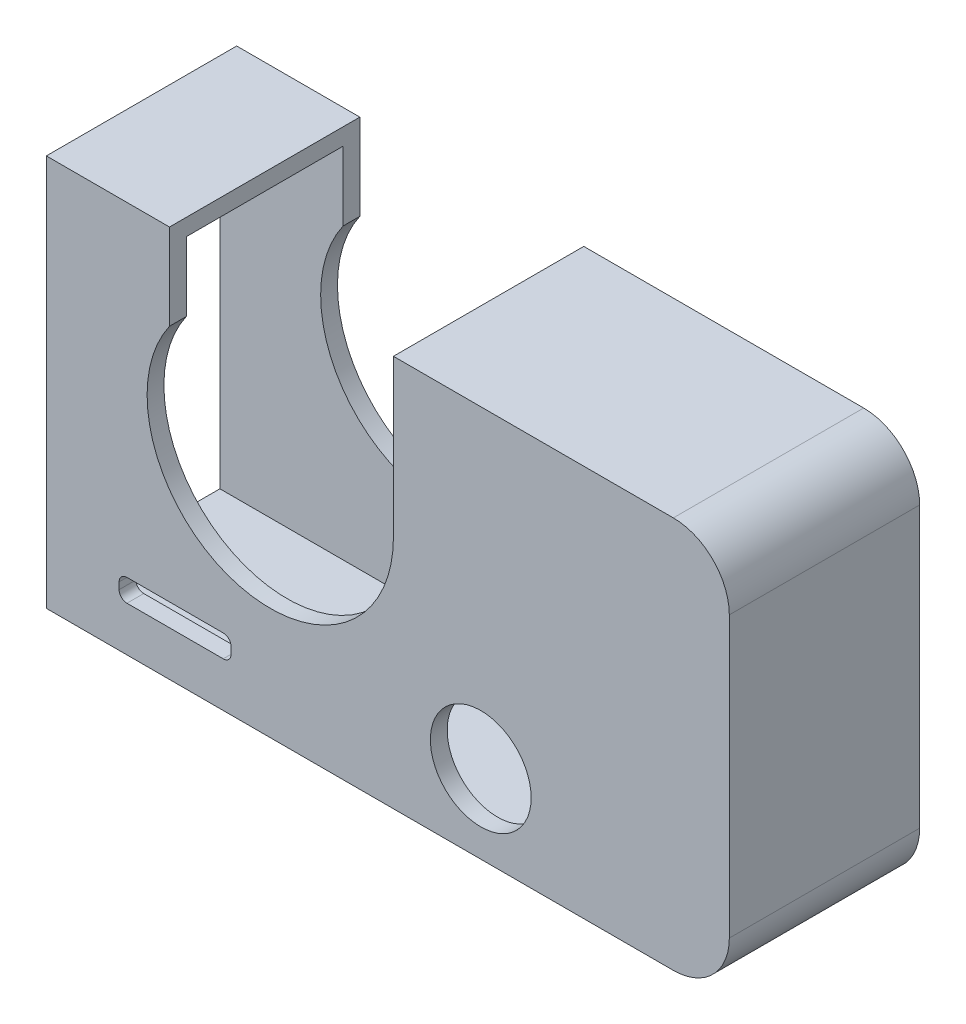
ISO-10303-21;
HEADER;
FILE_DESCRIPTION(('STEP AP214'),'2;1');
FILE_NAME('part.step','',(''),(''),'','','');
FILE_SCHEMA(('AUTOMOTIVE_DESIGN { 1 0 10303 214 1 1 1 1 }'));
ENDSEC;
DATA;
#1=APPLICATION_CONTEXT('core data for automotive mechanical design processes');
#2=APPLICATION_PROTOCOL_DEFINITION('international standard','automotive_design',2000,#1);
#3=PRODUCT_CONTEXT('',#1,'mechanical');
#4=PRODUCT('Part','Part','',(#3));
#5=PRODUCT_RELATED_PRODUCT_CATEGORY('part','',(#4));
#6=PRODUCT_DEFINITION_FORMATION('','',#4);
#7=PRODUCT_DEFINITION_CONTEXT('part definition',#1,'design');
#8=PRODUCT_DEFINITION('design','',#6,#7);
#9=PRODUCT_DEFINITION_SHAPE('','',#8);
#10=(LENGTH_UNIT() NAMED_UNIT(*) SI_UNIT(.MILLI.,.METRE.));
#11=(NAMED_UNIT(*) PLANE_ANGLE_UNIT() SI_UNIT($,.RADIAN.));
#12=(NAMED_UNIT(*) SI_UNIT($,.STERADIAN.) SOLID_ANGLE_UNIT());
#13=UNCERTAINTY_MEASURE_WITH_UNIT(LENGTH_MEASURE(1.E-05),#10,'distance_accuracy_value','');
#14=(GEOMETRIC_REPRESENTATION_CONTEXT(3) GLOBAL_UNCERTAINTY_ASSIGNED_CONTEXT((#13)) GLOBAL_UNIT_ASSIGNED_CONTEXT((#10,
#11,#12)) REPRESENTATION_CONTEXT('',''));
#15=CARTESIAN_POINT('',(0.,0.,0.));
#16=DIRECTION('',(0.,0.,1.));
#17=DIRECTION('',(1.,0.,0.));
#18=AXIS2_PLACEMENT_3D('',#15,#16,#17);
#19=CARTESIAN_POINT('',(20.,21.,17.));
#20=DIRECTION('',(0.,0.,-1.));
#21=DIRECTION('',(-1.,0.,0.));
#22=AXIS2_PLACEMENT_3D('',#19,#20,#21);
#23=CYLINDRICAL_SURFACE('',#22,11.);
#24=DIRECTION('',(0.,0.,-1.));
#25=VECTOR('',#24,1.);
#26=CARTESIAN_POINT('',(11.,27.3245553203368,17.));
#27=LINE('',#26,#25);
#28=CARTESIAN_POINT('',(11.,27.3245553203368,1.5));
#29=VERTEX_POINT('',#28);
#30=CARTESIAN_POINT('',(11.,27.3245553203368,0.));
#31=VERTEX_POINT('',#30);
#32=EDGE_CURVE('E466',#29,#31,#27,.T.);
#33=ORIENTED_EDGE('',*,*,#32,.F.);
#34=CARTESIAN_POINT('',(20.,21.,1.5));
#35=DIRECTION('',(0.,0.,1.));
#36=DIRECTION('',(1.,0.,0.));
#37=AXIS2_PLACEMENT_3D('',#34,#35,#36);
#38=CIRCLE('',#37,11.);
#39=CARTESIAN_POINT('',(31.,21.,1.5));
#40=VERTEX_POINT('',#39);
#41=EDGE_CURVE('E350',#29,#40,#38,.T.);
#42=ORIENTED_EDGE('',*,*,#41,.T.);
#43=DIRECTION('',(0.,0.,-1.));
#44=VECTOR('',#43,1.);
#45=CARTESIAN_POINT('',(31.,21.,17.));
#46=LINE('',#45,#44);
#47=CARTESIAN_POINT('',(31.,21.,0.));
#48=VERTEX_POINT('',#47);
#49=EDGE_CURVE('E471',#40,#48,#46,.T.);
#50=ORIENTED_EDGE('',*,*,#49,.T.);
#51=CARTESIAN_POINT('',(20.,21.,0.));
#52=DIRECTION('',(0.,0.,1.));
#53=DIRECTION('',(1.,0.,0.));
#54=AXIS2_PLACEMENT_3D('',#51,#52,#53);
#55=CIRCLE('',#54,11.);
#56=EDGE_CURVE('E429',#31,#48,#55,.T.);
#57=ORIENTED_EDGE('',*,*,#56,.F.);
#58=EDGE_LOOP('',(#33,#42,#50,#57));
#59=FACE_BOUND('',#58,.T.);
#60=ADVANCED_FACE('F41',(#59),#23,.F.);
#61=CARTESIAN_POINT('',(61.,0.,17.));
#62=DIRECTION('',(-1.,0.,0.));
#63=DIRECTION('',(0.,0.,1.));
#64=AXIS2_PLACEMENT_3D('',#61,#62,#63);
#65=PLANE('',#64);
#66=DIRECTION('',(0.,1.,0.));
#67=VECTOR('',#66,1.);
#68=CARTESIAN_POINT('',(61.,0.,0.));
#69=LINE('',#68,#67);
#70=CARTESIAN_POINT('',(61.,5.,0.));
#71=VERTEX_POINT('',#70);
#72=CARTESIAN_POINT('',(61.,30.,0.));
#73=VERTEX_POINT('',#72);
#74=EDGE_CURVE('E375',#71,#73,#69,.T.);
#75=ORIENTED_EDGE('',*,*,#74,.T.);
#76=DIRECTION('',(0.,0.,-1.));
#77=VECTOR('',#76,1.);
#78=CARTESIAN_POINT('',(61.,30.,17.));
#79=LINE('',#78,#77);
#80=CARTESIAN_POINT('',(61.,30.,17.));
#81=VERTEX_POINT('',#80);
#82=EDGE_CURVE('E482',#81,#73,#79,.T.);
#83=ORIENTED_EDGE('',*,*,#82,.F.);
#84=DIRECTION('',(0.,1.,0.));
#85=VECTOR('',#84,1.);
#86=CARTESIAN_POINT('',(61.,0.,17.));
#87=LINE('',#86,#85);
#88=CARTESIAN_POINT('',(61.,5.,17.));
#89=VERTEX_POINT('',#88);
#90=EDGE_CURVE('E376',#89,#81,#87,.T.);
#91=ORIENTED_EDGE('',*,*,#90,.F.);
#92=DIRECTION('',(0.,0.,-1.));
#93=VECTOR('',#92,1.);
#94=CARTESIAN_POINT('',(61.,5.,17.));
#95=LINE('',#94,#93);
#96=EDGE_CURVE('E413',#89,#71,#95,.T.);
#97=ORIENTED_EDGE('',*,*,#96,.T.);
#98=EDGE_LOOP('',(#75,#83,#91,#97));
#99=FACE_BOUND('',#98,.T.);
#100=ADVANCED_FACE('F43',(#99),#65,.F.);
#101=CARTESIAN_POINT('',(56.,30.,17.));
#102=DIRECTION('',(0.,0.,-1.));
#103=DIRECTION('',(-1.,0.,0.));
#104=AXIS2_PLACEMENT_3D('',#101,#102,#103);
#105=CYLINDRICAL_SURFACE('',#104,5.);
#106=CARTESIAN_POINT('',(56.,30.,0.));
#107=DIRECTION('',(0.,0.,1.));
#108=DIRECTION('',(1.,0.,0.));
#109=AXIS2_PLACEMENT_3D('',#106,#107,#108);
#110=CIRCLE('',#109,5.);
#111=CARTESIAN_POINT('',(56.,35.,0.));
#112=VERTEX_POINT('',#111);
#113=EDGE_CURVE('E417',#73,#112,#110,.T.);
#114=ORIENTED_EDGE('',*,*,#113,.T.);
#115=DIRECTION('',(0.,0.,-1.));
#116=VECTOR('',#115,1.);
#117=CARTESIAN_POINT('',(56.,35.,17.));
#118=LINE('',#117,#116);
#119=CARTESIAN_POINT('',(56.,35.,17.));
#120=VERTEX_POINT('',#119);
#121=EDGE_CURVE('E479',#120,#112,#118,.T.);
#122=ORIENTED_EDGE('',*,*,#121,.F.);
#123=CARTESIAN_POINT('',(56.,30.,17.));
#124=DIRECTION('',(0.,0.,1.));
#125=DIRECTION('',(1.,0.,0.));
#126=AXIS2_PLACEMENT_3D('',#123,#124,#125);
#127=CIRCLE('',#126,5.);
#128=EDGE_CURVE('E380',#81,#120,#127,.T.);
#129=ORIENTED_EDGE('',*,*,#128,.F.);
#130=ORIENTED_EDGE('',*,*,#82,.T.);
#131=EDGE_LOOP('',(#114,#122,#129,#130));
#132=FACE_BOUND('',#131,.T.);
#133=ADVANCED_FACE('F571',(#132),#105,.T.);
#134=CARTESIAN_POINT('',(0.,35.,17.));
#135=DIRECTION('',(0.,1.,0.));
#136=DIRECTION('',(0.,0.,1.));
#137=AXIS2_PLACEMENT_3D('',#134,#135,#136);
#138=PLANE('',#137);
#139=DIRECTION('',(1.,0.,0.));
#140=VECTOR('',#139,1.);
#141=CARTESIAN_POINT('',(0.,35.,0.));
#142=LINE('',#141,#140);
#143=CARTESIAN_POINT('',(31.,35.,0.));
#144=VERTEX_POINT('',#143);
#145=EDGE_CURVE('E421',#144,#112,#142,.T.);
#146=ORIENTED_EDGE('',*,*,#145,.F.);
#147=DIRECTION('',(0.,0.,-1.));
#148=VECTOR('',#147,1.);
#149=CARTESIAN_POINT('',(31.,35.,17.));
#150=LINE('',#149,#148);
#151=CARTESIAN_POINT('',(31.,35.,17.));
#152=VERTEX_POINT('',#151);
#153=EDGE_CURVE('E476',#152,#144,#150,.T.);
#154=ORIENTED_EDGE('',*,*,#153,.F.);
#155=DIRECTION('',(1.,0.,0.));
#156=VECTOR('',#155,1.);
#157=CARTESIAN_POINT('',(0.,35.,17.));
#158=LINE('',#157,#156);
#159=EDGE_CURVE('E384',#152,#120,#158,.T.);
#160=ORIENTED_EDGE('',*,*,#159,.T.);
#161=ORIENTED_EDGE('',*,*,#121,.T.);
#162=EDGE_LOOP('',(#146,#154,#160,#161));
#163=FACE_BOUND('',#162,.T.);
#164=ADVANCED_FACE('F586',(#163),#138,.T.);
#165=CARTESIAN_POINT('',(31.,0.,17.));
#166=DIRECTION('',(-1.,0.,0.));
#167=DIRECTION('',(0.,0.,1.));
#168=AXIS2_PLACEMENT_3D('',#165,#166,#167);
#169=PLANE('',#168);
#170=DIRECTION('',(0.,1.,0.));
#171=VECTOR('',#170,1.);
#172=CARTESIAN_POINT('',(31.,0.,15.5));
#173=LINE('',#172,#171);
#174=CARTESIAN_POINT('',(31.,21.,15.5));
#175=VERTEX_POINT('',#174);
#176=CARTESIAN_POINT('',(31.,33.5,15.5));
#177=VERTEX_POINT('',#176);
#178=EDGE_CURVE('E369',#175,#177,#173,.T.);
#179=ORIENTED_EDGE('',*,*,#178,.F.);
#180=CARTESIAN_POINT('',(31.,21.,17.));
#181=VERTEX_POINT('',#180);
#182=EDGE_CURVE('E472',#181,#175,#46,.T.);
#183=ORIENTED_EDGE('',*,*,#182,.F.);
#184=DIRECTION('',(0.,1.,0.));
#185=VECTOR('',#184,1.);
#186=CARTESIAN_POINT('',(31.,0.,17.));
#187=LINE('',#186,#185);
#188=EDGE_CURVE('E388',#181,#152,#187,.T.);
#189=ORIENTED_EDGE('',*,*,#188,.T.);
#190=ORIENTED_EDGE('',*,*,#153,.T.);
#191=DIRECTION('',(0.,1.,0.));
#192=VECTOR('',#191,1.);
#193=CARTESIAN_POINT('',(31.,0.,0.));
#194=LINE('',#193,#192);
#195=EDGE_CURVE('E425',#48,#144,#194,.T.);
#196=ORIENTED_EDGE('',*,*,#195,.F.);
#197=ORIENTED_EDGE('',*,*,#49,.F.);
#198=DIRECTION('',(0.,1.,0.));
#199=VECTOR('',#198,1.);
#200=CARTESIAN_POINT('',(31.,0.,1.5));
#201=LINE('',#200,#199);
#202=CARTESIAN_POINT('',(31.,33.5,1.5));
#203=VERTEX_POINT('',#202);
#204=EDGE_CURVE('E362',#40,#203,#201,.T.);
#205=ORIENTED_EDGE('',*,*,#204,.T.);
#206=DIRECTION('',(0.,0.,-1.));
#207=VECTOR('',#206,1.);
#208=CARTESIAN_POINT('',(31.,33.5,17.));
#209=LINE('',#208,#207);
#210=EDGE_CURVE('E372',#177,#203,#209,.T.);
#211=ORIENTED_EDGE('',*,*,#210,.F.);
#212=EDGE_LOOP('',(#179,#183,#189,#190,#196,#197,#205,#211));
#213=FACE_BOUND('',#212,.T.);
#214=ADVANCED_FACE('F578',(#213),#169,.T.);
#215=CARTESIAN_POINT('',(20.,21.,15.5));
#216=DIRECTION('',(0.,0.,1.));
#217=DIRECTION('',(1.,0.,0.));
#218=AXIS2_PLACEMENT_3D('',#215,#216,#217);
#219=CIRCLE('',#218,11.);
#220=CARTESIAN_POINT('',(11.,27.3245553203368,15.5));
#221=VERTEX_POINT('',#220);
#222=EDGE_CURVE('E366',#221,#175,#219,.T.);
#223=ORIENTED_EDGE('',*,*,#222,.F.);
#224=CARTESIAN_POINT('',(11.,27.3245553203368,17.));
#225=VERTEX_POINT('',#224);
#226=EDGE_CURVE('E467',#225,#221,#27,.T.);
#227=ORIENTED_EDGE('',*,*,#226,.F.);
#228=CARTESIAN_POINT('',(20.,21.,17.));
#229=DIRECTION('',(0.,0.,1.));
#230=DIRECTION('',(1.,0.,0.));
#231=AXIS2_PLACEMENT_3D('',#228,#229,#230);
#232=CIRCLE('',#231,11.);
#233=EDGE_CURVE('E392',#225,#181,#232,.T.);
#234=ORIENTED_EDGE('',*,*,#233,.T.);
#235=ORIENTED_EDGE('',*,*,#182,.T.);
#236=EDGE_LOOP('',(#223,#227,#234,#235));
#237=FACE_BOUND('',#236,.T.);
#238=ADVANCED_FACE('F567',(#237),#23,.F.);
#239=CARTESIAN_POINT('',(11.,0.,17.));
#240=DIRECTION('',(-1.,0.,0.));
#241=DIRECTION('',(0.,0.,1.));
#242=AXIS2_PLACEMENT_3D('',#239,#240,#241);
#243=PLANE('',#242);
#244=ORIENTED_EDGE('',*,*,#226,.T.);
#245=DIRECTION('',(0.,1.,0.));
#246=VECTOR('',#245,1.);
#247=CARTESIAN_POINT('',(11.,0.,15.5));
#248=LINE('',#247,#246);
#249=CARTESIAN_POINT('',(11.,33.5,15.5));
#250=VERTEX_POINT('',#249);
#251=EDGE_CURVE('E493',#221,#250,#248,.T.);
#252=ORIENTED_EDGE('',*,*,#251,.T.);
#253=DIRECTION('',(0.,0.,-1.));
#254=VECTOR('',#253,1.);
#255=CARTESIAN_POINT('',(11.,33.5,17.));
#256=LINE('',#255,#254);
#257=CARTESIAN_POINT('',(11.,33.5,1.5));
#258=VERTEX_POINT('',#257);
#259=EDGE_CURVE('E489',#250,#258,#256,.T.);
#260=ORIENTED_EDGE('',*,*,#259,.T.);
#261=DIRECTION('',(0.,1.,0.));
#262=VECTOR('',#261,1.);
#263=CARTESIAN_POINT('',(11.,0.,1.5));
#264=LINE('',#263,#262);
#265=EDGE_CURVE('E486',#29,#258,#264,.T.);
#266=ORIENTED_EDGE('',*,*,#265,.F.);
#267=ORIENTED_EDGE('',*,*,#32,.T.);
#268=DIRECTION('',(0.,1.,0.));
#269=VECTOR('',#268,1.);
#270=CARTESIAN_POINT('',(11.,0.,0.));
#271=LINE('',#270,#269);
#272=CARTESIAN_POINT('',(11.,35.,0.));
#273=VERTEX_POINT('',#272);
#274=EDGE_CURVE('E433',#31,#273,#271,.T.);
#275=ORIENTED_EDGE('',*,*,#274,.T.);
#276=DIRECTION('',(0.,0.,-1.));
#277=VECTOR('',#276,1.);
#278=CARTESIAN_POINT('',(11.,35.,17.));
#279=LINE('',#278,#277);
#280=CARTESIAN_POINT('',(11.,35.,17.));
#281=VERTEX_POINT('',#280);
#282=EDGE_CURVE('E463',#281,#273,#279,.T.);
#283=ORIENTED_EDGE('',*,*,#282,.F.);
#284=DIRECTION('',(0.,1.,0.));
#285=VECTOR('',#284,1.);
#286=CARTESIAN_POINT('',(11.,0.,17.));
#287=LINE('',#286,#285);
#288=EDGE_CURVE('E396',#225,#281,#287,.T.);
#289=ORIENTED_EDGE('',*,*,#288,.F.);
#290=EDGE_LOOP('',(#244,#252,#260,#266,#267,#275,#283,#289));
#291=FACE_BOUND('',#290,.T.);
#292=ADVANCED_FACE('F577',(#291),#243,.F.);
#293=CARTESIAN_POINT('',(0.,35.,17.));
#294=DIRECTION('',(0.,1.,0.));
#295=DIRECTION('',(0.,0.,1.));
#296=AXIS2_PLACEMENT_3D('',#293,#294,#295);
#297=PLANE('',#296);
#298=DIRECTION('',(1.,0.,0.));
#299=VECTOR('',#298,1.);
#300=CARTESIAN_POINT('',(0.,35.,0.));
#301=LINE('',#300,#299);
#302=CARTESIAN_POINT('',(0.,35.,0.));
#303=VERTEX_POINT('',#302);
#304=EDGE_CURVE('E437',#303,#273,#301,.T.);
#305=ORIENTED_EDGE('',*,*,#304,.F.);
#306=DIRECTION('',(0.,0.,-1.));
#307=VECTOR('',#306,1.);
#308=CARTESIAN_POINT('',(0.,35.,17.));
#309=LINE('',#308,#307);
#310=CARTESIAN_POINT('',(0.,35.,17.));
#311=VERTEX_POINT('',#310);
#312=EDGE_CURVE('E460',#311,#303,#309,.T.);
#313=ORIENTED_EDGE('',*,*,#312,.F.);
#314=DIRECTION('',(1.,0.,0.));
#315=VECTOR('',#314,1.);
#316=CARTESIAN_POINT('',(0.,35.,17.));
#317=LINE('',#316,#315);
#318=EDGE_CURVE('E399',#311,#281,#317,.T.);
#319=ORIENTED_EDGE('',*,*,#318,.T.);
#320=ORIENTED_EDGE('',*,*,#282,.T.);
#321=EDGE_LOOP('',(#305,#313,#319,#320));
#322=FACE_BOUND('',#321,.T.);
#323=ADVANCED_FACE('F584',(#322),#297,.T.);
#324=CARTESIAN_POINT('',(0.,0.,17.));
#325=DIRECTION('',(-1.,0.,0.));
#326=DIRECTION('',(0.,0.,1.));
#327=AXIS2_PLACEMENT_3D('',#324,#325,#326);
#328=PLANE('',#327);
#329=DIRECTION('',(0.,-1.,0.));
#330=VECTOR('',#329,1.);
#331=CARTESIAN_POINT('',(0.,33.5,1.5));
#332=LINE('',#331,#330);
#333=CARTESIAN_POINT('',(0.,33.5,1.5));
#334=VERTEX_POINT('',#333);
#335=CARTESIAN_POINT('',(0.,1.5,1.5));
#336=VERTEX_POINT('',#335);
#337=EDGE_CURVE('E249',#334,#336,#332,.T.);
#338=ORIENTED_EDGE('',*,*,#337,.F.);
#339=DIRECTION('',(0.,0.,-1.));
#340=VECTOR('',#339,1.);
#341=CARTESIAN_POINT('',(0.,33.5,1.5));
#342=LINE('',#341,#340);
#343=CARTESIAN_POINT('',(0.,33.5,15.5));
#344=VERTEX_POINT('',#343);
#345=EDGE_CURVE('E254',#344,#334,#342,.T.);
#346=ORIENTED_EDGE('',*,*,#345,.F.);
#347=DIRECTION('',(0.,1.,0.));
#348=VECTOR('',#347,1.);
#349=CARTESIAN_POINT('',(0.,33.5,15.5));
#350=LINE('',#349,#348);
#351=CARTESIAN_POINT('',(0.,1.5,15.5));
#352=VERTEX_POINT('',#351);
#353=EDGE_CURVE('E235',#352,#344,#350,.T.);
#354=ORIENTED_EDGE('',*,*,#353,.F.);
#355=DIRECTION('',(0.,0.,1.));
#356=VECTOR('',#355,1.);
#357=CARTESIAN_POINT('',(0.,1.5,1.5));
#358=LINE('',#357,#356);
#359=EDGE_CURVE('E244',#336,#352,#358,.T.);
#360=ORIENTED_EDGE('',*,*,#359,.F.);
#361=EDGE_LOOP('',(#338,#346,#354,#360));
#362=FACE_BOUND('',#361,.T.);
#363=DIRECTION('',(0.,1.,0.));
#364=VECTOR('',#363,1.);
#365=CARTESIAN_POINT('',(0.,0.,0.));
#366=LINE('',#365,#364);
#367=CARTESIAN_POINT('',(0.,0.,0.));
#368=VERTEX_POINT('',#367);
#369=EDGE_CURVE('E441',#368,#303,#366,.T.);
#370=ORIENTED_EDGE('',*,*,#369,.F.);
#371=DIRECTION('',(0.,0.,-1.));
#372=VECTOR('',#371,1.);
#373=CARTESIAN_POINT('',(0.,0.,17.));
#374=LINE('',#373,#372);
#375=CARTESIAN_POINT('',(0.,0.,17.));
#376=VERTEX_POINT('',#375);
#377=EDGE_CURVE('E457',#376,#368,#374,.T.);
#378=ORIENTED_EDGE('',*,*,#377,.F.);
#379=DIRECTION('',(0.,1.,0.));
#380=VECTOR('',#379,1.);
#381=CARTESIAN_POINT('',(0.,0.,17.));
#382=LINE('',#381,#380);
#383=EDGE_CURVE('E403',#376,#311,#382,.T.);
#384=ORIENTED_EDGE('',*,*,#383,.T.);
#385=ORIENTED_EDGE('',*,*,#312,.T.);
#386=EDGE_LOOP('',(#370,#378,#384,#385));
#387=FACE_BOUND('',#386,.T.);
#388=ADVANCED_FACE('F251',(#362,#387),#328,.T.);
#389=CARTESIAN_POINT('',(0.,0.,17.));
#390=DIRECTION('',(0.,1.,0.));
#391=DIRECTION('',(0.,0.,1.));
#392=AXIS2_PLACEMENT_3D('',#389,#390,#391);
#393=PLANE('',#392);
#394=DIRECTION('',(1.,0.,0.));
#395=VECTOR('',#394,1.);
#396=CARTESIAN_POINT('',(0.,0.,0.));
#397=LINE('',#396,#395);
#398=CARTESIAN_POINT('',(56.,0.,0.));
#399=VERTEX_POINT('',#398);
#400=EDGE_CURVE('E445',#368,#399,#397,.T.);
#401=ORIENTED_EDGE('',*,*,#400,.T.);
#402=DIRECTION('',(0.,0.,-1.));
#403=VECTOR('',#402,1.);
#404=CARTESIAN_POINT('',(56.,0.,17.));
#405=LINE('',#404,#403);
#406=CARTESIAN_POINT('',(56.,0.,17.));
#407=VERTEX_POINT('',#406);
#408=EDGE_CURVE('E453',#407,#399,#405,.T.);
#409=ORIENTED_EDGE('',*,*,#408,.F.);
#410=DIRECTION('',(1.,0.,0.));
#411=VECTOR('',#410,1.);
#412=CARTESIAN_POINT('',(0.,0.,17.));
#413=LINE('',#412,#411);
#414=EDGE_CURVE('E407',#376,#407,#413,.T.);
#415=ORIENTED_EDGE('',*,*,#414,.F.);
#416=ORIENTED_EDGE('',*,*,#377,.T.);
#417=EDGE_LOOP('',(#401,#409,#415,#416));
#418=FACE_BOUND('',#417,.T.);
#419=ADVANCED_FACE('F643',(#418),#393,.F.);
#420=CARTESIAN_POINT('',(56.,5.,17.));
#421=DIRECTION('',(0.,0.,-1.));
#422=DIRECTION('',(-1.,0.,0.));
#423=AXIS2_PLACEMENT_3D('',#420,#421,#422);
#424=CYLINDRICAL_SURFACE('',#423,5.);
#425=CARTESIAN_POINT('',(56.,5.,0.));
#426=DIRECTION('',(0.,0.,1.));
#427=DIRECTION('',(1.,0.,0.));
#428=AXIS2_PLACEMENT_3D('',#425,#426,#427);
#429=CIRCLE('',#428,5.);
#430=EDGE_CURVE('E381',#399,#71,#429,.T.);
#431=ORIENTED_EDGE('',*,*,#430,.T.);
#432=ORIENTED_EDGE('',*,*,#96,.F.);
#433=CARTESIAN_POINT('',(56.,5.,17.));
#434=DIRECTION('',(0.,0.,1.));
#435=DIRECTION('',(1.,0.,0.));
#436=AXIS2_PLACEMENT_3D('',#433,#434,#435);
#437=CIRCLE('',#436,5.);
#438=EDGE_CURVE('E410',#407,#89,#437,.T.);
#439=ORIENTED_EDGE('',*,*,#438,.F.);
#440=ORIENTED_EDGE('',*,*,#408,.T.);
#441=EDGE_LOOP('',(#431,#432,#439,#440));
#442=FACE_BOUND('',#441,.T.);
#443=ADVANCED_FACE('F634',(#442),#424,.T.);
#444=CARTESIAN_POINT('',(0.,0.,17.));
#445=DIRECTION('',(0.,0.,1.));
#446=DIRECTION('',(1.,0.,0.));
#447=AXIS2_PLACEMENT_3D('',#444,#445,#446);
#448=PLANE('',#447);
#449=CARTESIAN_POINT('',(38.8,7.,17.));
#450=DIRECTION('',(0.,0.,1.));
#451=DIRECTION('',(1.,0.,0.));
#452=AXIS2_PLACEMENT_3D('',#449,#450,#451);
#453=CIRCLE('',#452,4.5);
#454=CARTESIAN_POINT('',(43.3,7.,17.));
#455=VERTEX_POINT('',#454);
#456=EDGE_CURVE('E623',#455,#455,#453,.T.);
#457=ORIENTED_EDGE('',*,*,#456,.F.);
#458=EDGE_LOOP('',(#457));
#459=FACE_BOUND('',#458,.T.);
#460=CARTESIAN_POINT('',(15.8,4.7,17.));
#461=DIRECTION('',(0.,0.,1.));
#462=DIRECTION('',(-1.,0.,0.));
#463=AXIS2_PLACEMENT_3D('',#460,#461,#462);
#464=CIRCLE('',#463,0.7);
#465=CARTESIAN_POINT('',(15.8,4.,17.));
#466=VERTEX_POINT('',#465);
#467=CARTESIAN_POINT('',(16.5,4.7,17.));
#468=VERTEX_POINT('',#467);
#469=EDGE_CURVE('E66',#466,#468,#464,.T.);
#470=ORIENTED_EDGE('',*,*,#469,.F.);
#471=DIRECTION('',(1.,0.,0.));
#472=VECTOR('',#471,1.);
#473=CARTESIAN_POINT('',(7.2,4.,17.));
#474=LINE('',#473,#472);
#475=CARTESIAN_POINT('',(7.2,4.,17.));
#476=VERTEX_POINT('',#475);
#477=EDGE_CURVE('E287',#476,#466,#474,.T.);
#478=ORIENTED_EDGE('',*,*,#477,.F.);
#479=CARTESIAN_POINT('',(7.2,4.7,17.));
#480=DIRECTION('',(0.,0.,1.));
#481=DIRECTION('',(1.,0.,0.));
#482=AXIS2_PLACEMENT_3D('',#479,#480,#481);
#483=CIRCLE('',#482,0.7);
#484=CARTESIAN_POINT('',(6.5,4.7,17.));
#485=VERTEX_POINT('',#484);
#486=EDGE_CURVE('E283',#485,#476,#483,.T.);
#487=ORIENTED_EDGE('',*,*,#486,.F.);
#488=DIRECTION('',(0.,-1.,0.));
#489=VECTOR('',#488,1.);
#490=CARTESIAN_POINT('',(6.5,4.7,17.));
#491=LINE('',#490,#489);
#492=CARTESIAN_POINT('',(6.5,5.3,17.));
#493=VERTEX_POINT('',#492);
#494=EDGE_CURVE('E279',#493,#485,#491,.T.);
#495=ORIENTED_EDGE('',*,*,#494,.F.);
#496=CARTESIAN_POINT('',(7.2,5.3,17.));
#497=DIRECTION('',(0.,0.,1.));
#498=DIRECTION('',(1.,0.,0.));
#499=AXIS2_PLACEMENT_3D('',#496,#497,#498);
#500=CIRCLE('',#499,0.7);
#501=CARTESIAN_POINT('',(7.2,6.,17.));
#502=VERTEX_POINT('',#501);
#503=EDGE_CURVE('E275',#502,#493,#500,.T.);
#504=ORIENTED_EDGE('',*,*,#503,.F.);
#505=DIRECTION('',(-1.,0.,0.));
#506=VECTOR('',#505,1.);
#507=CARTESIAN_POINT('',(7.2,6.,17.));
#508=LINE('',#507,#506);
#509=CARTESIAN_POINT('',(15.8,6.,17.));
#510=VERTEX_POINT('',#509);
#511=EDGE_CURVE('E271',#510,#502,#508,.T.);
#512=ORIENTED_EDGE('',*,*,#511,.F.);
#513=CARTESIAN_POINT('',(15.8,5.3,17.));
#514=DIRECTION('',(0.,0.,1.));
#515=DIRECTION('',(1.,0.,0.));
#516=AXIS2_PLACEMENT_3D('',#513,#514,#515);
#517=CIRCLE('',#516,0.7);
#518=CARTESIAN_POINT('',(16.5,5.3,17.));
#519=VERTEX_POINT('',#518);
#520=EDGE_CURVE('E267',#519,#510,#517,.T.);
#521=ORIENTED_EDGE('',*,*,#520,.F.);
#522=DIRECTION('',(0.,1.,0.));
#523=VECTOR('',#522,1.);
#524=CARTESIAN_POINT('',(16.5,4.7,17.));
#525=LINE('',#524,#523);
#526=EDGE_CURVE('E263',#468,#519,#525,.T.);
#527=ORIENTED_EDGE('',*,*,#526,.F.);
#528=EDGE_LOOP('',(#470,#478,#487,#495,#504,#512,#521,#527));
#529=FACE_BOUND('',#528,.T.);
#530=ORIENTED_EDGE('',*,*,#90,.T.);
#531=ORIENTED_EDGE('',*,*,#128,.T.);
#532=ORIENTED_EDGE('',*,*,#159,.F.);
#533=ORIENTED_EDGE('',*,*,#188,.F.);
#534=ORIENTED_EDGE('',*,*,#233,.F.);
#535=ORIENTED_EDGE('',*,*,#288,.T.);
#536=ORIENTED_EDGE('',*,*,#318,.F.);
#537=ORIENTED_EDGE('',*,*,#383,.F.);
#538=ORIENTED_EDGE('',*,*,#414,.T.);
#539=ORIENTED_EDGE('',*,*,#438,.T.);
#540=EDGE_LOOP('',(#530,#531,#532,#533,#534,#535,#536,#537,#538,#539));
#541=FACE_BOUND('',#540,.T.);
#542=ADVANCED_FACE('F532',(#459,#529,#541),#448,.T.);
#543=CARTESIAN_POINT('',(0.,0.,0.));
#544=DIRECTION('',(0.,0.,1.));
#545=DIRECTION('',(1.,0.,0.));
#546=AXIS2_PLACEMENT_3D('',#543,#544,#545);
#547=PLANE('',#546);
#548=ORIENTED_EDGE('',*,*,#74,.F.);
#549=ORIENTED_EDGE('',*,*,#430,.F.);
#550=ORIENTED_EDGE('',*,*,#400,.F.);
#551=ORIENTED_EDGE('',*,*,#369,.T.);
#552=ORIENTED_EDGE('',*,*,#304,.T.);
#553=ORIENTED_EDGE('',*,*,#274,.F.);
#554=ORIENTED_EDGE('',*,*,#56,.T.);
#555=ORIENTED_EDGE('',*,*,#195,.T.);
#556=ORIENTED_EDGE('',*,*,#145,.T.);
#557=ORIENTED_EDGE('',*,*,#113,.F.);
#558=EDGE_LOOP('',(#548,#549,#550,#551,#552,#553,#554,#555,#556,#557));
#559=FACE_BOUND('',#558,.T.);
#560=ADVANCED_FACE('F633',(#559),#547,.F.);
#561=CARTESIAN_POINT('',(54.5,33.5,15.5));
#562=DIRECTION('',(0.,1.,0.));
#563=DIRECTION('',(0.,0.,1.));
#564=AXIS2_PLACEMENT_3D('',#561,#562,#563);
#565=PLANE('',#564);
#566=DIRECTION('',(1.,0.,0.));
#567=VECTOR('',#566,1.);
#568=CARTESIAN_POINT('',(54.5,33.5,15.5));
#569=LINE('',#568,#567);
#570=EDGE_CURVE('E316',#344,#250,#569,.T.);
#571=ORIENTED_EDGE('',*,*,#570,.F.);
#572=ORIENTED_EDGE('',*,*,#345,.T.);
#573=DIRECTION('',(1.,0.,0.));
#574=VECTOR('',#573,1.);
#575=CARTESIAN_POINT('',(54.5,33.5,1.5));
#576=LINE('',#575,#574);
#577=EDGE_CURVE('E329',#334,#258,#576,.T.);
#578=ORIENTED_EDGE('',*,*,#577,.T.);
#579=ORIENTED_EDGE('',*,*,#259,.F.);
#580=EDGE_LOOP('',(#571,#572,#578,#579));
#581=FACE_BOUND('',#580,.T.);
#582=ADVANCED_FACE('F640',(#581),#565,.F.);
#583=CARTESIAN_POINT('',(1.5,1.5,15.5));
#584=DIRECTION('',(0.,-1.,0.));
#585=DIRECTION('',(1.,0.,0.));
#586=AXIS2_PLACEMENT_3D('',#583,#584,#585);
#587=PLANE('',#586);
#588=ORIENTED_EDGE('',*,*,#359,.T.);
#589=DIRECTION('',(-1.,0.,0.));
#590=VECTOR('',#589,1.);
#591=CARTESIAN_POINT('',(1.5,1.5,15.5));
#592=LINE('',#591,#590);
#593=CARTESIAN_POINT('',(54.5,1.5,15.5));
#594=VERTEX_POINT('',#593);
#595=EDGE_CURVE('E231',#594,#352,#592,.T.);
#596=ORIENTED_EDGE('',*,*,#595,.F.);
#597=DIRECTION('',(0.,0.,-1.));
#598=VECTOR('',#597,1.);
#599=CARTESIAN_POINT('',(54.5,1.5,15.5));
#600=LINE('',#599,#598);
#601=CARTESIAN_POINT('',(54.5,1.5,1.5));
#602=VERTEX_POINT('',#601);
#603=EDGE_CURVE('E347',#594,#602,#600,.T.);
#604=ORIENTED_EDGE('',*,*,#603,.T.);
#605=DIRECTION('',(-1.,0.,0.));
#606=VECTOR('',#605,1.);
#607=CARTESIAN_POINT('',(1.5,1.5,1.5));
#608=LINE('',#607,#606);
#609=EDGE_CURVE('E58',#602,#336,#608,.T.);
#610=ORIENTED_EDGE('',*,*,#609,.T.);
#611=EDGE_LOOP('',(#588,#596,#604,#610));
#612=FACE_BOUND('',#611,.T.);
#613=ADVANCED_FACE('F245',(#612),#587,.F.);
#614=CARTESIAN_POINT('',(54.5,6.49999999999999,15.5));
#615=DIRECTION('',(0.,0.,-1.));
#616=DIRECTION('',(-1.,0.,0.));
#617=AXIS2_PLACEMENT_3D('',#614,#615,#616);
#618=CYLINDRICAL_SURFACE('',#617,5.);
#619=CARTESIAN_POINT('',(54.5,6.49999999999999,1.5));
#620=DIRECTION('',(0.,0.,-1.));
#621=DIRECTION('',(1.,0.,0.));
#622=AXIS2_PLACEMENT_3D('',#619,#620,#621);
#623=CIRCLE('',#622,5.);
#624=CARTESIAN_POINT('',(59.5,6.5,1.5));
#625=VERTEX_POINT('',#624);
#626=EDGE_CURVE('E341',#625,#602,#623,.T.);
#627=ORIENTED_EDGE('',*,*,#626,.T.);
#628=ORIENTED_EDGE('',*,*,#603,.F.);
#629=CARTESIAN_POINT('',(54.5,6.49999999999999,15.5));
#630=DIRECTION('',(0.,0.,-1.));
#631=DIRECTION('',(1.,0.,0.));
#632=AXIS2_PLACEMENT_3D('',#629,#630,#631);
#633=CIRCLE('',#632,5.);
#634=CARTESIAN_POINT('',(59.5,6.5,15.5));
#635=VERTEX_POINT('',#634);
#636=EDGE_CURVE('E239',#635,#594,#633,.T.);
#637=ORIENTED_EDGE('',*,*,#636,.F.);
#638=DIRECTION('',(0.,0.,-1.));
#639=VECTOR('',#638,1.);
#640=CARTESIAN_POINT('',(59.5,6.5,15.5));
#641=LINE('',#640,#639);
#642=EDGE_CURVE('E351',#635,#625,#641,.T.);
#643=ORIENTED_EDGE('',*,*,#642,.T.);
#644=EDGE_LOOP('',(#627,#628,#637,#643));
#645=FACE_BOUND('',#644,.T.);
#646=ADVANCED_FACE('F619',(#645),#618,.F.);
#647=CARTESIAN_POINT('',(59.5,6.5,15.5));
#648=DIRECTION('',(1.,0.,0.));
#649=DIRECTION('',(0.,0.,-1.));
#650=AXIS2_PLACEMENT_3D('',#647,#648,#649);
#651=PLANE('',#650);
#652=DIRECTION('',(0.,-1.,0.));
#653=VECTOR('',#652,1.);
#654=CARTESIAN_POINT('',(59.5,6.5,1.5));
#655=LINE('',#654,#653);
#656=CARTESIAN_POINT('',(59.5,28.5,1.5));
#657=VERTEX_POINT('',#656);
#658=EDGE_CURVE('E337',#657,#625,#655,.T.);
#659=ORIENTED_EDGE('',*,*,#658,.T.);
#660=ORIENTED_EDGE('',*,*,#642,.F.);
#661=DIRECTION('',(0.,-1.,0.));
#662=VECTOR('',#661,1.);
#663=CARTESIAN_POINT('',(59.5,6.5,15.5));
#664=LINE('',#663,#662);
#665=CARTESIAN_POINT('',(59.5,28.5,15.5));
#666=VERTEX_POINT('',#665);
#667=EDGE_CURVE('E324',#666,#635,#664,.T.);
#668=ORIENTED_EDGE('',*,*,#667,.F.);
#669=DIRECTION('',(0.,0.,-1.));
#670=VECTOR('',#669,1.);
#671=CARTESIAN_POINT('',(59.5,28.5,15.5));
#672=LINE('',#671,#670);
#673=EDGE_CURVE('E354',#666,#657,#672,.T.);
#674=ORIENTED_EDGE('',*,*,#673,.T.);
#675=EDGE_LOOP('',(#659,#660,#668,#674));
#676=FACE_BOUND('',#675,.T.);
#677=ADVANCED_FACE('F616',(#676),#651,.F.);
#678=CARTESIAN_POINT('',(54.5,28.5,15.5));
#679=DIRECTION('',(0.,0.,-1.));
#680=DIRECTION('',(-1.,0.,0.));
#681=AXIS2_PLACEMENT_3D('',#678,#679,#680);
#682=CYLINDRICAL_SURFACE('',#681,5.);
#683=CARTESIAN_POINT('',(54.5,28.5,1.5));
#684=DIRECTION('',(0.,0.,-1.));
#685=DIRECTION('',(-1.,0.,0.));
#686=AXIS2_PLACEMENT_3D('',#683,#684,#685);
#687=CIRCLE('',#686,5.);
#688=CARTESIAN_POINT('',(54.5,33.5,1.5));
#689=VERTEX_POINT('',#688);
#690=EDGE_CURVE('E333',#689,#657,#687,.T.);
#691=ORIENTED_EDGE('',*,*,#690,.T.);
#692=ORIENTED_EDGE('',*,*,#673,.F.);
#693=CARTESIAN_POINT('',(54.5,28.5,15.5));
#694=DIRECTION('',(0.,0.,-1.));
#695=DIRECTION('',(-1.,0.,0.));
#696=AXIS2_PLACEMENT_3D('',#693,#694,#695);
#697=CIRCLE('',#696,5.);
#698=CARTESIAN_POINT('',(54.5,33.5,15.5));
#699=VERTEX_POINT('',#698);
#700=EDGE_CURVE('E319',#699,#666,#697,.T.);
#701=ORIENTED_EDGE('',*,*,#700,.F.);
#702=DIRECTION('',(0.,0.,-1.));
#703=VECTOR('',#702,1.);
#704=CARTESIAN_POINT('',(54.5,33.5,15.5));
#705=LINE('',#704,#703);
#706=EDGE_CURVE('E241',#699,#689,#705,.T.);
#707=ORIENTED_EDGE('',*,*,#706,.T.);
#708=EDGE_LOOP('',(#691,#692,#701,#707));
#709=FACE_BOUND('',#708,.T.);
#710=ADVANCED_FACE('F611',(#709),#682,.F.);
#711=ORIENTED_EDGE('',*,*,#210,.T.);
#712=EDGE_CURVE('E295',#203,#689,#576,.T.);
#713=ORIENTED_EDGE('',*,*,#712,.T.);
#714=ORIENTED_EDGE('',*,*,#706,.F.);
#715=EDGE_CURVE('E320',#177,#699,#569,.T.);
#716=ORIENTED_EDGE('',*,*,#715,.F.);
#717=EDGE_LOOP('',(#711,#713,#714,#716));
#718=FACE_BOUND('',#717,.T.);
#719=ADVANCED_FACE('F602',(#718),#565,.F.);
#720=CARTESIAN_POINT('',(54.5,6.49999999999999,15.5));
#721=DIRECTION('',(0.,0.,1.));
#722=DIRECTION('',(1.,0.,0.));
#723=AXIS2_PLACEMENT_3D('',#720,#721,#722);
#724=PLANE('',#723);
#725=CARTESIAN_POINT('',(38.8,7.,15.5));
#726=DIRECTION('',(0.,0.,1.));
#727=DIRECTION('',(1.,0.,0.));
#728=AXIS2_PLACEMENT_3D('',#725,#726,#727);
#729=CIRCLE('',#728,4.5);
#730=CARTESIAN_POINT('',(43.3,7.,15.5));
#731=VERTEX_POINT('',#730);
#732=EDGE_CURVE('E45',#731,#731,#729,.T.);
#733=ORIENTED_EDGE('',*,*,#732,.T.);
#734=EDGE_LOOP('',(#733));
#735=FACE_BOUND('',#734,.T.);
#736=DIRECTION('',(-1.,0.,0.));
#737=VECTOR('',#736,1.);
#738=CARTESIAN_POINT('',(54.5,6.,15.5));
#739=LINE('',#738,#737);
#740=CARTESIAN_POINT('',(15.8,6.,15.5));
#741=VERTEX_POINT('',#740);
#742=CARTESIAN_POINT('',(7.2,6.,15.5));
#743=VERTEX_POINT('',#742);
#744=EDGE_CURVE('E505',#741,#743,#739,.T.);
#745=ORIENTED_EDGE('',*,*,#744,.T.);
#746=CARTESIAN_POINT('',(7.2,5.3,15.5));
#747=DIRECTION('',(0.,0.,1.));
#748=DIRECTION('',(1.,0.,0.));
#749=AXIS2_PLACEMENT_3D('',#746,#747,#748);
#750=CIRCLE('',#749,0.7);
#751=CARTESIAN_POINT('',(6.5,5.3,15.5));
#752=VERTEX_POINT('',#751);
#753=EDGE_CURVE('E508',#743,#752,#750,.T.);
#754=ORIENTED_EDGE('',*,*,#753,.T.);
#755=DIRECTION('',(0.,-1.,0.));
#756=VECTOR('',#755,1.);
#757=CARTESIAN_POINT('',(6.5,6.49999999999999,15.5));
#758=LINE('',#757,#756);
#759=CARTESIAN_POINT('',(6.5,4.7,15.5));
#760=VERTEX_POINT('',#759);
#761=EDGE_CURVE('E512',#752,#760,#758,.T.);
#762=ORIENTED_EDGE('',*,*,#761,.T.);
#763=CARTESIAN_POINT('',(7.2,4.7,15.5));
#764=DIRECTION('',(0.,0.,1.));
#765=DIRECTION('',(1.,0.,0.));
#766=AXIS2_PLACEMENT_3D('',#763,#764,#765);
#767=CIRCLE('',#766,0.7);
#768=CARTESIAN_POINT('',(7.2,4.,15.5));
#769=VERTEX_POINT('',#768);
#770=EDGE_CURVE('E516',#760,#769,#767,.T.);
#771=ORIENTED_EDGE('',*,*,#770,.T.);
#772=DIRECTION('',(1.,0.,0.));
#773=VECTOR('',#772,1.);
#774=CARTESIAN_POINT('',(54.5,4.,15.5));
#775=LINE('',#774,#773);
#776=CARTESIAN_POINT('',(15.8,4.,15.5));
#777=VERTEX_POINT('',#776);
#778=EDGE_CURVE('E51',#769,#777,#775,.T.);
#779=ORIENTED_EDGE('',*,*,#778,.T.);
#780=CARTESIAN_POINT('',(15.8,4.7,15.5));
#781=DIRECTION('',(0.,0.,1.));
#782=DIRECTION('',(1.,0.,0.));
#783=AXIS2_PLACEMENT_3D('',#780,#781,#782);
#784=CIRCLE('',#783,0.7);
#785=CARTESIAN_POINT('',(16.5,4.7,15.5));
#786=VERTEX_POINT('',#785);
#787=EDGE_CURVE('E11',#777,#786,#784,.T.);
#788=ORIENTED_EDGE('',*,*,#787,.T.);
#789=DIRECTION('',(0.,1.,0.));
#790=VECTOR('',#789,1.);
#791=CARTESIAN_POINT('',(16.5,6.49999999999999,15.5));
#792=LINE('',#791,#790);
#793=CARTESIAN_POINT('',(16.5,5.3,15.5));
#794=VERTEX_POINT('',#793);
#795=EDGE_CURVE('E497',#786,#794,#792,.T.);
#796=ORIENTED_EDGE('',*,*,#795,.T.);
#797=CARTESIAN_POINT('',(15.8,5.3,15.5));
#798=DIRECTION('',(0.,0.,1.));
#799=DIRECTION('',(1.,0.,0.));
#800=AXIS2_PLACEMENT_3D('',#797,#798,#799);
#801=CIRCLE('',#800,0.7);
#802=EDGE_CURVE('E501',#794,#741,#801,.T.);
#803=ORIENTED_EDGE('',*,*,#802,.T.);
#804=EDGE_LOOP('',(#745,#754,#762,#771,#779,#788,#796,#803));
#805=FACE_BOUND('',#804,.T.);
#806=ORIENTED_EDGE('',*,*,#222,.T.);
#807=ORIENTED_EDGE('',*,*,#178,.T.);
#808=ORIENTED_EDGE('',*,*,#715,.T.);
#809=ORIENTED_EDGE('',*,*,#700,.T.);
#810=ORIENTED_EDGE('',*,*,#667,.T.);
#811=ORIENTED_EDGE('',*,*,#636,.T.);
#812=ORIENTED_EDGE('',*,*,#595,.T.);
#813=ORIENTED_EDGE('',*,*,#353,.T.);
#814=ORIENTED_EDGE('',*,*,#570,.T.);
#815=ORIENTED_EDGE('',*,*,#251,.F.);
#816=EDGE_LOOP('',(#806,#807,#808,#809,#810,#811,#812,#813,#814,#815));
#817=FACE_BOUND('',#816,.T.);
#818=ADVANCED_FACE('F232',(#735,#805,#817),#724,.F.);
#819=CARTESIAN_POINT('',(54.5,6.49999999999999,1.5));
#820=DIRECTION('',(0.,0.,1.));
#821=DIRECTION('',(1.,0.,0.));
#822=AXIS2_PLACEMENT_3D('',#819,#820,#821);
#823=PLANE('',#822);
#824=ORIENTED_EDGE('',*,*,#337,.T.);
#825=ORIENTED_EDGE('',*,*,#609,.F.);
#826=ORIENTED_EDGE('',*,*,#626,.F.);
#827=ORIENTED_EDGE('',*,*,#658,.F.);
#828=ORIENTED_EDGE('',*,*,#690,.F.);
#829=ORIENTED_EDGE('',*,*,#712,.F.);
#830=ORIENTED_EDGE('',*,*,#204,.F.);
#831=ORIENTED_EDGE('',*,*,#41,.F.);
#832=ORIENTED_EDGE('',*,*,#265,.T.);
#833=ORIENTED_EDGE('',*,*,#577,.F.);
#834=EDGE_LOOP('',(#824,#825,#826,#827,#828,#829,#830,#831,#832,#833));
#835=FACE_BOUND('',#834,.T.);
#836=ADVANCED_FACE('F613',(#835),#823,.T.);
#837=CARTESIAN_POINT('',(15.8,4.7,12.));
#838=DIRECTION('',(0.,0.,1.));
#839=DIRECTION('',(1.,0.,0.));
#840=AXIS2_PLACEMENT_3D('',#837,#838,#839);
#841=CYLINDRICAL_SURFACE('',#840,0.7);
#842=DIRECTION('',(0.,0.,1.));
#843=VECTOR('',#842,1.);
#844=CARTESIAN_POINT('',(15.8,4.,12.));
#845=LINE('',#844,#843);
#846=EDGE_CURVE('E292',#777,#466,#845,.T.);
#847=ORIENTED_EDGE('',*,*,#846,.T.);
#848=ORIENTED_EDGE('',*,*,#469,.T.);
#849=DIRECTION('',(0.,0.,1.));
#850=VECTOR('',#849,1.);
#851=CARTESIAN_POINT('',(16.5,4.7,12.));
#852=LINE('',#851,#850);
#853=EDGE_CURVE('E291',#786,#468,#852,.T.);
#854=ORIENTED_EDGE('',*,*,#853,.F.);
#855=ORIENTED_EDGE('',*,*,#787,.F.);
#856=EDGE_LOOP('',(#847,#848,#854,#855));
#857=FACE_BOUND('',#856,.T.);
#858=ADVANCED_FACE('F526',(#857),#841,.F.);
#859=CARTESIAN_POINT('',(7.2,4.,12.));
#860=DIRECTION('',(0.,-1.,0.));
#861=DIRECTION('',(1.,0.,0.));
#862=AXIS2_PLACEMENT_3D('',#859,#860,#861);
#863=PLANE('',#862);
#864=DIRECTION('',(0.,0.,1.));
#865=VECTOR('',#864,1.);
#866=CARTESIAN_POINT('',(7.2,4.,12.));
#867=LINE('',#866,#865);
#868=EDGE_CURVE('E296',#769,#476,#867,.T.);
#869=ORIENTED_EDGE('',*,*,#868,.T.);
#870=ORIENTED_EDGE('',*,*,#477,.T.);
#871=ORIENTED_EDGE('',*,*,#846,.F.);
#872=ORIENTED_EDGE('',*,*,#778,.F.);
#873=EDGE_LOOP('',(#869,#870,#871,#872));
#874=FACE_BOUND('',#873,.T.);
#875=ADVANCED_FACE('F527',(#874),#863,.F.);
#876=CARTESIAN_POINT('',(7.2,4.7,12.));
#877=DIRECTION('',(0.,0.,1.));
#878=DIRECTION('',(1.,0.,0.));
#879=AXIS2_PLACEMENT_3D('',#876,#877,#878);
#880=CYLINDRICAL_SURFACE('',#879,0.7);
#881=DIRECTION('',(0.,0.,1.));
#882=VECTOR('',#881,1.);
#883=CARTESIAN_POINT('',(6.5,4.7,12.));
#884=LINE('',#883,#882);
#885=EDGE_CURVE('E299',#760,#485,#884,.T.);
#886=ORIENTED_EDGE('',*,*,#885,.T.);
#887=ORIENTED_EDGE('',*,*,#486,.T.);
#888=ORIENTED_EDGE('',*,*,#868,.F.);
#889=ORIENTED_EDGE('',*,*,#770,.F.);
#890=EDGE_LOOP('',(#886,#887,#888,#889));
#891=FACE_BOUND('',#890,.T.);
#892=ADVANCED_FACE('F555',(#891),#880,.F.);
#893=CARTESIAN_POINT('',(6.5,4.7,12.));
#894=DIRECTION('',(-1.,0.,0.));
#895=DIRECTION('',(0.,0.,1.));
#896=AXIS2_PLACEMENT_3D('',#893,#894,#895);
#897=PLANE('',#896);
#898=DIRECTION('',(0.,0.,1.));
#899=VECTOR('',#898,1.);
#900=CARTESIAN_POINT('',(6.5,5.3,12.));
#901=LINE('',#900,#899);
#902=EDGE_CURVE('E302',#752,#493,#901,.T.);
#903=ORIENTED_EDGE('',*,*,#902,.T.);
#904=ORIENTED_EDGE('',*,*,#494,.T.);
#905=ORIENTED_EDGE('',*,*,#885,.F.);
#906=ORIENTED_EDGE('',*,*,#761,.F.);
#907=EDGE_LOOP('',(#903,#904,#905,#906));
#908=FACE_BOUND('',#907,.T.);
#909=ADVANCED_FACE('F553',(#908),#897,.F.);
#910=CARTESIAN_POINT('',(7.2,5.3,12.));
#911=DIRECTION('',(0.,0.,1.));
#912=DIRECTION('',(1.,0.,0.));
#913=AXIS2_PLACEMENT_3D('',#910,#911,#912);
#914=CYLINDRICAL_SURFACE('',#913,0.7);
#915=DIRECTION('',(0.,0.,1.));
#916=VECTOR('',#915,1.);
#917=CARTESIAN_POINT('',(7.2,6.,12.));
#918=LINE('',#917,#916);
#919=EDGE_CURVE('E305',#743,#502,#918,.T.);
#920=ORIENTED_EDGE('',*,*,#919,.T.);
#921=ORIENTED_EDGE('',*,*,#503,.T.);
#922=ORIENTED_EDGE('',*,*,#902,.F.);
#923=ORIENTED_EDGE('',*,*,#753,.F.);
#924=EDGE_LOOP('',(#920,#921,#922,#923));
#925=FACE_BOUND('',#924,.T.);
#926=ADVANCED_FACE('F548',(#925),#914,.F.);
#927=CARTESIAN_POINT('',(7.2,6.,12.));
#928=DIRECTION('',(0.,1.,0.));
#929=DIRECTION('',(0.,0.,1.));
#930=AXIS2_PLACEMENT_3D('',#927,#928,#929);
#931=PLANE('',#930);
#932=DIRECTION('',(0.,0.,1.));
#933=VECTOR('',#932,1.);
#934=CARTESIAN_POINT('',(15.8,6.,12.));
#935=LINE('',#934,#933);
#936=EDGE_CURVE('E308',#741,#510,#935,.T.);
#937=ORIENTED_EDGE('',*,*,#936,.T.);
#938=ORIENTED_EDGE('',*,*,#511,.T.);
#939=ORIENTED_EDGE('',*,*,#919,.F.);
#940=ORIENTED_EDGE('',*,*,#744,.F.);
#941=EDGE_LOOP('',(#937,#938,#939,#940));
#942=FACE_BOUND('',#941,.T.);
#943=ADVANCED_FACE('F544',(#942),#931,.F.);
#944=CARTESIAN_POINT('',(15.8,5.3,12.));
#945=DIRECTION('',(0.,0.,1.));
#946=DIRECTION('',(1.,0.,0.));
#947=AXIS2_PLACEMENT_3D('',#944,#945,#946);
#948=CYLINDRICAL_SURFACE('',#947,0.7);
#949=DIRECTION('',(0.,0.,1.));
#950=VECTOR('',#949,1.);
#951=CARTESIAN_POINT('',(16.5,5.3,12.));
#952=LINE('',#951,#950);
#953=EDGE_CURVE('E311',#794,#519,#952,.T.);
#954=ORIENTED_EDGE('',*,*,#953,.T.);
#955=ORIENTED_EDGE('',*,*,#520,.T.);
#956=ORIENTED_EDGE('',*,*,#936,.F.);
#957=ORIENTED_EDGE('',*,*,#802,.F.);
#958=EDGE_LOOP('',(#954,#955,#956,#957));
#959=FACE_BOUND('',#958,.T.);
#960=ADVANCED_FACE('F542',(#959),#948,.F.);
#961=CARTESIAN_POINT('',(16.5,4.7,12.));
#962=DIRECTION('',(1.,0.,0.));
#963=DIRECTION('',(0.,0.,-1.));
#964=AXIS2_PLACEMENT_3D('',#961,#962,#963);
#965=PLANE('',#964);
#966=ORIENTED_EDGE('',*,*,#853,.T.);
#967=ORIENTED_EDGE('',*,*,#526,.T.);
#968=ORIENTED_EDGE('',*,*,#953,.F.);
#969=ORIENTED_EDGE('',*,*,#795,.F.);
#970=EDGE_LOOP('',(#966,#967,#968,#969));
#971=FACE_BOUND('',#970,.T.);
#972=ADVANCED_FACE('F537',(#971),#965,.F.);
#973=CARTESIAN_POINT('',(38.8,7.,6.5));
#974=DIRECTION('',(0.,0.,1.));
#975=DIRECTION('',(1.,0.,0.));
#976=AXIS2_PLACEMENT_3D('',#973,#974,#975);
#977=CYLINDRICAL_SURFACE('',#976,4.5);
#978=CARTESIAN_POINT('',(43.3,7.,17.));
#979=CARTESIAN_POINT('',(43.3,7.,16.984375));
#980=CARTESIAN_POINT('',(43.3,7.,16.96875));
#981=CARTESIAN_POINT('',(43.3,7.,16.9375));
#982=CARTESIAN_POINT('',(43.3,7.,16.921875));
#983=CARTESIAN_POINT('',(43.3,7.,16.890625));
#984=CARTESIAN_POINT('',(43.3,7.,16.875));
#985=CARTESIAN_POINT('',(43.3,7.,16.84375));
#986=CARTESIAN_POINT('',(43.3,7.,16.828125));
#987=CARTESIAN_POINT('',(43.3,7.,16.796875));
#988=CARTESIAN_POINT('',(43.3,7.,16.78125));
#989=CARTESIAN_POINT('',(43.3,7.,16.75));
#990=CARTESIAN_POINT('',(43.3,7.,16.734375));
#991=CARTESIAN_POINT('',(43.3,7.,16.703125));
#992=CARTESIAN_POINT('',(43.3,7.,16.6875));
#993=CARTESIAN_POINT('',(43.3,7.,16.65625));
#994=CARTESIAN_POINT('',(43.3,7.,16.640625));
#995=CARTESIAN_POINT('',(43.3,7.,16.609375));
#996=CARTESIAN_POINT('',(43.3,7.,16.59375));
#997=CARTESIAN_POINT('',(43.3,7.,16.5625));
#998=CARTESIAN_POINT('',(43.3,7.,16.546875));
#999=CARTESIAN_POINT('',(43.3,7.,16.515625));
#1000=CARTESIAN_POINT('',(43.3,7.,16.5));
#1001=CARTESIAN_POINT('',(43.3,7.,16.46875));
#1002=CARTESIAN_POINT('',(43.3,7.,16.453125));
#1003=CARTESIAN_POINT('',(43.3,7.,16.421875));
#1004=CARTESIAN_POINT('',(43.3,7.,16.40625));
#1005=CARTESIAN_POINT('',(43.3,7.,16.375));
#1006=CARTESIAN_POINT('',(43.3,7.,16.359375));
#1007=CARTESIAN_POINT('',(43.3,7.,16.328125));
#1008=CARTESIAN_POINT('',(43.3,7.,16.3125));
#1009=CARTESIAN_POINT('',(43.3,7.,16.28125));
#1010=CARTESIAN_POINT('',(43.3,7.,16.265625));
#1011=CARTESIAN_POINT('',(43.3,7.,16.234375));
#1012=CARTESIAN_POINT('',(43.3,7.,16.21875));
#1013=CARTESIAN_POINT('',(43.3,7.,16.1875));
#1014=CARTESIAN_POINT('',(43.3,7.,16.171875));
#1015=CARTESIAN_POINT('',(43.3,7.,16.140625));
#1016=CARTESIAN_POINT('',(43.3,7.,16.125));
#1017=CARTESIAN_POINT('',(43.3,7.,16.09375));
#1018=CARTESIAN_POINT('',(43.3,7.,16.078125));
#1019=CARTESIAN_POINT('',(43.3,7.,16.046875));
#1020=CARTESIAN_POINT('',(43.3,7.,16.03125));
#1021=CARTESIAN_POINT('',(43.3,7.,16.));
#1022=CARTESIAN_POINT('',(43.3,7.,15.984375));
#1023=CARTESIAN_POINT('',(43.3,7.,15.953125));
#1024=CARTESIAN_POINT('',(43.3,7.,15.9375));
#1025=CARTESIAN_POINT('',(43.3,7.,15.90625));
#1026=CARTESIAN_POINT('',(43.3,7.,15.890625));
#1027=CARTESIAN_POINT('',(43.3,7.,15.859375));
#1028=CARTESIAN_POINT('',(43.3,7.,15.84375));
#1029=CARTESIAN_POINT('',(43.3,7.,15.8125));
#1030=CARTESIAN_POINT('',(43.3,7.,15.796875));
#1031=CARTESIAN_POINT('',(43.3,7.,15.765625));
#1032=CARTESIAN_POINT('',(43.3,7.,15.75));
#1033=CARTESIAN_POINT('',(43.3,7.,15.71875));
#1034=CARTESIAN_POINT('',(43.3,7.,15.703125));
#1035=CARTESIAN_POINT('',(43.3,7.,15.671875));
#1036=CARTESIAN_POINT('',(43.3,7.,15.65625));
#1037=CARTESIAN_POINT('',(43.3,7.,15.625));
#1038=CARTESIAN_POINT('',(43.3,7.,15.609375));
#1039=CARTESIAN_POINT('',(43.3,7.,15.578125));
#1040=CARTESIAN_POINT('',(43.3,7.,15.5625));
#1041=CARTESIAN_POINT('',(43.3,7.,15.53125));
#1042=CARTESIAN_POINT('',(43.3,7.,15.515625));
#1043=CARTESIAN_POINT('',(43.3,7.,15.5));
#1044=B_SPLINE_CURVE_WITH_KNOTS('',3,(#978,#979,#980,#981,#982,#983,#984,#985,#986,#987,#988,
#989,#990,#991,#992,#993,#994,#995,#996,#997,#998,#999,#1000,#1001,#1002,#1003,#1004,#1005,
#1006,#1007,#1008,#1009,#1010,#1011,#1012,#1013,#1014,#1015,#1016,#1017,#1018,#1019,#1020,#1021,
#1022,#1023,#1024,#1025,#1026,#1027,#1028,#1029,#1030,#1031,#1032,#1033,#1034,#1035,#1036,#1037,
#1038,#1039,#1040,#1041,#1042,#1043),.UNSPECIFIED.,.F.,.F.,(4,2,2,2,2,2,2,2,2,2,2,2,2,2,2,2,2,2,
2,2,2,2,2,2,2,2,2,2,2,2,2,2,4),(0.,0.0468749999999983,0.0937500000000001,0.140625000000002,
0.1875,0.234374999999998,0.28125,0.328125000000002,0.375,0.421874999999999,0.46875,
0.515624999999999,0.562499999999997,0.609374999999999,0.656250000000001,0.703124999999999,
0.749999999999997,0.796874999999999,0.843750000000001,0.890624999999999,0.937499999999997,
0.984374999999999,1.03125,1.078125,1.125,1.171875,1.21875,1.265625,1.3125,1.359375,1.40625,
1.453125,1.5),.UNSPECIFIED.);
#1045=EDGE_CURVE('BSEAM629',#455,#731,#1044,.T.);
#1046=ORIENTED_EDGE('',*,*,#456,.T.);
#1047=ORIENTED_EDGE('',*,*,#732,.F.);
#1048=ORIENTED_EDGE('',*,*,#1045,.T.);
#1049=ORIENTED_EDGE('',*,*,#1045,.F.);
#1050=EDGE_LOOP('',(#1046,#1048,#1047,#1049));
#1051=FACE_BOUND('',#1050,.T.);
#1052=ADVANCED_FACE('F629',(#1051),#977,.F.);
#1053=CLOSED_SHELL('',(#60,#100,#133,#164,#214,#238,#292,#323,#388,#419,#443,#542,#560,#582,
#613,#646,#677,#710,#719,#818,#836,#858,#875,#892,#909,#926,#943,#960,#972,#1052));
#1054=MANIFOLD_SOLID_BREP('B2',#1053);
#1055=ADVANCED_BREP_SHAPE_REPRESENTATION('',(#18,#1054),#14);
#1056=SHAPE_DEFINITION_REPRESENTATION(#9,#1055);
ENDSEC;
END-ISO-10303-21;
